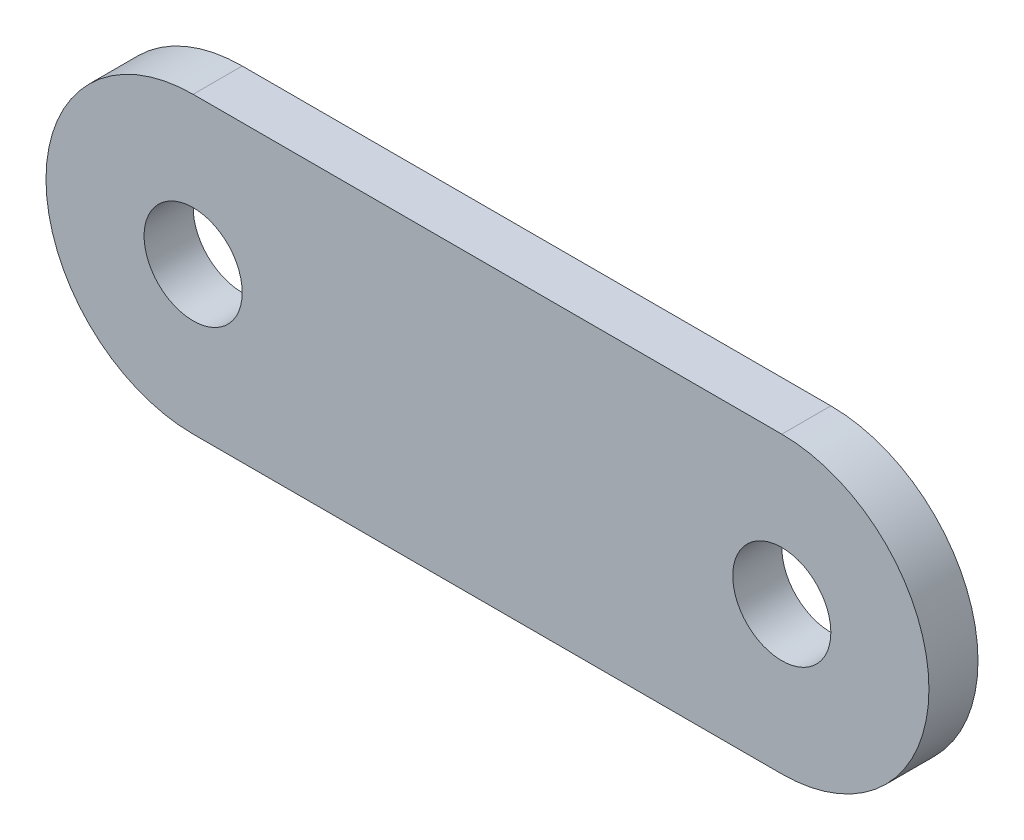
ISO-10303-21;
HEADER;
FILE_DESCRIPTION(('STEP AP214'),'2;1');
FILE_NAME('part.step','',(''),(''),'','','');
FILE_SCHEMA(('AUTOMOTIVE_DESIGN { 1 0 10303 214 1 1 1 1 }'));
ENDSEC;
DATA;
#1=APPLICATION_CONTEXT('core data for automotive mechanical design processes');
#2=APPLICATION_PROTOCOL_DEFINITION('international standard','automotive_design',2000,#1);
#3=PRODUCT_CONTEXT('',#1,'mechanical');
#4=PRODUCT('Part','Part','',(#3));
#5=PRODUCT_RELATED_PRODUCT_CATEGORY('part','',(#4));
#6=PRODUCT_DEFINITION_FORMATION('','',#4);
#7=PRODUCT_DEFINITION_CONTEXT('part definition',#1,'design');
#8=PRODUCT_DEFINITION('design','',#6,#7);
#9=PRODUCT_DEFINITION_SHAPE('','',#8);
#10=(LENGTH_UNIT() NAMED_UNIT(*) SI_UNIT(.MILLI.,.METRE.));
#11=(NAMED_UNIT(*) PLANE_ANGLE_UNIT() SI_UNIT($,.RADIAN.));
#12=(NAMED_UNIT(*) SI_UNIT($,.STERADIAN.) SOLID_ANGLE_UNIT());
#13=UNCERTAINTY_MEASURE_WITH_UNIT(LENGTH_MEASURE(1.E-05),#10,'distance_accuracy_value','');
#14=(GEOMETRIC_REPRESENTATION_CONTEXT(3) GLOBAL_UNCERTAINTY_ASSIGNED_CONTEXT((#13)) GLOBAL_UNIT_ASSIGNED_CONTEXT((#10,
#11,#12)) REPRESENTATION_CONTEXT('',''));
#15=CARTESIAN_POINT('',(0.,0.,0.));
#16=DIRECTION('',(0.,0.,1.));
#17=DIRECTION('',(1.,0.,0.));
#18=AXIS2_PLACEMENT_3D('',#15,#16,#17);
#19=CARTESIAN_POINT('',(-6.,0.,1.));
#20=DIRECTION('',(0.,0.,1.));
#21=DIRECTION('',(1.,0.,0.));
#22=AXIS2_PLACEMENT_3D('',#19,#20,#21);
#23=PLANE('',#22);
#24=CARTESIAN_POINT('',(6.,0.,1.));
#25=DIRECTION('',(0.,0.,1.));
#26=DIRECTION('',(1.,0.,0.));
#27=AXIS2_PLACEMENT_3D('',#24,#25,#26);
#28=CIRCLE('',#27,1.);
#29=CARTESIAN_POINT('',(7.,0.,1.));
#30=VERTEX_POINT('',#29);
#31=EDGE_CURVE('E100',#30,#30,#28,.T.);
#32=ORIENTED_EDGE('',*,*,#31,.F.);
#33=EDGE_LOOP('',(#32));
#34=FACE_BOUND('',#33,.T.);
#35=CARTESIAN_POINT('',(-6.,0.,1.));
#36=DIRECTION('',(0.,0.,1.));
#37=DIRECTION('',(1.,0.,0.));
#38=AXIS2_PLACEMENT_3D('',#35,#36,#37);
#39=CIRCLE('',#38,3.);
#40=CARTESIAN_POINT('',(-6.,3.,1.));
#41=VERTEX_POINT('',#40);
#42=CARTESIAN_POINT('',(-6.,-3.,1.));
#43=VERTEX_POINT('',#42);
#44=EDGE_CURVE('E85',#41,#43,#39,.T.);
#45=ORIENTED_EDGE('',*,*,#44,.T.);
#46=DIRECTION('',(1.,0.,0.));
#47=VECTOR('',#46,1.);
#48=CARTESIAN_POINT('',(-6.,-3.,1.));
#49=LINE('',#48,#47);
#50=CARTESIAN_POINT('',(6.,-3.,1.));
#51=VERTEX_POINT('',#50);
#52=EDGE_CURVE('E80',#43,#51,#49,.T.);
#53=ORIENTED_EDGE('',*,*,#52,.T.);
#54=CARTESIAN_POINT('',(6.,0.,1.));
#55=DIRECTION('',(0.,0.,1.));
#56=DIRECTION('',(1.,0.,0.));
#57=AXIS2_PLACEMENT_3D('',#54,#55,#56);
#58=CIRCLE('',#57,3.);
#59=CARTESIAN_POINT('',(6.,3.,1.));
#60=VERTEX_POINT('',#59);
#61=EDGE_CURVE('E83',#51,#60,#58,.T.);
#62=ORIENTED_EDGE('',*,*,#61,.T.);
#63=DIRECTION('',(-1.,0.,0.));
#64=VECTOR('',#63,1.);
#65=CARTESIAN_POINT('',(-6.,3.,1.));
#66=LINE('',#65,#64);
#67=EDGE_CURVE('E50',#60,#41,#66,.T.);
#68=ORIENTED_EDGE('',*,*,#67,.T.);
#69=EDGE_LOOP('',(#45,#53,#62,#68));
#70=FACE_BOUND('',#69,.T.);
#71=CARTESIAN_POINT('',(-6.,0.,1.));
#72=DIRECTION('',(0.,0.,1.));
#73=DIRECTION('',(1.,0.,0.));
#74=AXIS2_PLACEMENT_3D('',#71,#72,#73);
#75=CIRCLE('',#74,1.);
#76=CARTESIAN_POINT('',(-5.,0.,1.));
#77=VERTEX_POINT('',#76);
#78=EDGE_CURVE('E115',#77,#77,#75,.T.);
#79=ORIENTED_EDGE('',*,*,#78,.F.);
#80=EDGE_LOOP('',(#79));
#81=FACE_BOUND('',#80,.T.);
#82=ADVANCED_FACE('F33',(#34,#70,#81),#23,.T.);
#83=CARTESIAN_POINT('',(-6.,0.,0.));
#84=DIRECTION('',(0.,0.,1.));
#85=DIRECTION('',(1.,0.,0.));
#86=AXIS2_PLACEMENT_3D('',#83,#84,#85);
#87=PLANE('',#86);
#88=CARTESIAN_POINT('',(-6.,0.,0.));
#89=DIRECTION('',(0.,0.,1.));
#90=DIRECTION('',(1.,0.,0.));
#91=AXIS2_PLACEMENT_3D('',#88,#89,#90);
#92=CIRCLE('',#91,3.);
#93=CARTESIAN_POINT('',(-6.,3.,0.));
#94=VERTEX_POINT('',#93);
#95=CARTESIAN_POINT('',(-6.,-3.,0.));
#96=VERTEX_POINT('',#95);
#97=EDGE_CURVE('E97',#94,#96,#92,.T.);
#98=ORIENTED_EDGE('',*,*,#97,.F.);
#99=DIRECTION('',(-1.,0.,0.));
#100=VECTOR('',#99,1.);
#101=CARTESIAN_POINT('',(-6.,3.,0.));
#102=LINE('',#101,#100);
#103=CARTESIAN_POINT('',(6.,3.,0.));
#104=VERTEX_POINT('',#103);
#105=EDGE_CURVE('E73',#104,#94,#102,.T.);
#106=ORIENTED_EDGE('',*,*,#105,.F.);
#107=CARTESIAN_POINT('',(6.,0.,0.));
#108=DIRECTION('',(0.,0.,1.));
#109=DIRECTION('',(1.,0.,0.));
#110=AXIS2_PLACEMENT_3D('',#107,#108,#109);
#111=CIRCLE('',#110,3.);
#112=CARTESIAN_POINT('',(6.,-3.,0.));
#113=VERTEX_POINT('',#112);
#114=EDGE_CURVE('E67',#113,#104,#111,.T.);
#115=ORIENTED_EDGE('',*,*,#114,.F.);
#116=DIRECTION('',(1.,0.,0.));
#117=VECTOR('',#116,1.);
#118=CARTESIAN_POINT('',(-6.,-3.,0.));
#119=LINE('',#118,#117);
#120=EDGE_CURVE('E89',#96,#113,#119,.T.);
#121=ORIENTED_EDGE('',*,*,#120,.F.);
#122=EDGE_LOOP('',(#98,#106,#115,#121));
#123=FACE_BOUND('',#122,.T.);
#124=CARTESIAN_POINT('',(6.,0.,0.));
#125=DIRECTION('',(0.,0.,1.));
#126=DIRECTION('',(1.,0.,0.));
#127=AXIS2_PLACEMENT_3D('',#124,#125,#126);
#128=CIRCLE('',#127,1.);
#129=CARTESIAN_POINT('',(7.,0.,0.));
#130=VERTEX_POINT('',#129);
#131=EDGE_CURVE('E112',#130,#130,#128,.T.);
#132=ORIENTED_EDGE('',*,*,#131,.T.);
#133=EDGE_LOOP('',(#132));
#134=FACE_BOUND('',#133,.T.);
#135=CARTESIAN_POINT('',(-6.,0.,0.));
#136=DIRECTION('',(0.,0.,1.));
#137=DIRECTION('',(1.,0.,0.));
#138=AXIS2_PLACEMENT_3D('',#135,#136,#137);
#139=CIRCLE('',#138,1.);
#140=CARTESIAN_POINT('',(-5.,0.,0.));
#141=VERTEX_POINT('',#140);
#142=EDGE_CURVE('E118',#141,#141,#139,.T.);
#143=ORIENTED_EDGE('',*,*,#142,.T.);
#144=EDGE_LOOP('',(#143));
#145=FACE_BOUND('',#144,.T.);
#146=ADVANCED_FACE('F108',(#123,#134,#145),#87,.F.);
#147=CARTESIAN_POINT('',(-6.,0.,1.));
#148=DIRECTION('',(0.,0.,-1.));
#149=DIRECTION('',(-1.,0.,0.));
#150=AXIS2_PLACEMENT_3D('',#147,#148,#149);
#151=CYLINDRICAL_SURFACE('',#150,3.);
#152=ORIENTED_EDGE('',*,*,#97,.T.);
#153=DIRECTION('',(0.,0.,-1.));
#154=VECTOR('',#153,1.);
#155=CARTESIAN_POINT('',(-6.,-3.,1.));
#156=LINE('',#155,#154);
#157=EDGE_CURVE('E11',#43,#96,#156,.T.);
#158=ORIENTED_EDGE('',*,*,#157,.F.);
#159=ORIENTED_EDGE('',*,*,#44,.F.);
#160=DIRECTION('',(0.,0.,-1.));
#161=VECTOR('',#160,1.);
#162=CARTESIAN_POINT('',(-6.,3.,1.));
#163=LINE('',#162,#161);
#164=EDGE_CURVE('E93',#41,#94,#163,.T.);
#165=ORIENTED_EDGE('',*,*,#164,.T.);
#166=EDGE_LOOP('',(#152,#158,#159,#165));
#167=FACE_BOUND('',#166,.T.);
#168=ADVANCED_FACE('F35',(#167),#151,.T.);
#169=CARTESIAN_POINT('',(-6.,-3.,1.));
#170=DIRECTION('',(0.,1.,0.));
#171=DIRECTION('',(-1.,0.,0.));
#172=AXIS2_PLACEMENT_3D('',#169,#170,#171);
#173=PLANE('',#172);
#174=ORIENTED_EDGE('',*,*,#120,.T.);
#175=DIRECTION('',(0.,0.,-1.));
#176=VECTOR('',#175,1.);
#177=CARTESIAN_POINT('',(6.,-3.,1.));
#178=LINE('',#177,#176);
#179=EDGE_CURVE('E42',#51,#113,#178,.T.);
#180=ORIENTED_EDGE('',*,*,#179,.F.);
#181=ORIENTED_EDGE('',*,*,#52,.F.);
#182=ORIENTED_EDGE('',*,*,#157,.T.);
#183=EDGE_LOOP('',(#174,#180,#181,#182));
#184=FACE_BOUND('',#183,.T.);
#185=ADVANCED_FACE('F88',(#184),#173,.F.);
#186=CARTESIAN_POINT('',(6.,0.,1.));
#187=DIRECTION('',(0.,0.,-1.));
#188=DIRECTION('',(-1.,0.,0.));
#189=AXIS2_PLACEMENT_3D('',#186,#187,#188);
#190=CYLINDRICAL_SURFACE('',#189,3.);
#191=ORIENTED_EDGE('',*,*,#114,.T.);
#192=DIRECTION('',(0.,0.,-1.));
#193=VECTOR('',#192,1.);
#194=CARTESIAN_POINT('',(6.,3.,1.));
#195=LINE('',#194,#193);
#196=EDGE_CURVE('E90',#60,#104,#195,.T.);
#197=ORIENTED_EDGE('',*,*,#196,.F.);
#198=ORIENTED_EDGE('',*,*,#61,.F.);
#199=ORIENTED_EDGE('',*,*,#179,.T.);
#200=EDGE_LOOP('',(#191,#197,#198,#199));
#201=FACE_BOUND('',#200,.T.);
#202=ADVANCED_FACE('F91',(#201),#190,.T.);
#203=CARTESIAN_POINT('',(-6.,3.,1.));
#204=DIRECTION('',(0.,-1.,0.));
#205=DIRECTION('',(1.,0.,0.));
#206=AXIS2_PLACEMENT_3D('',#203,#204,#205);
#207=PLANE('',#206);
#208=ORIENTED_EDGE('',*,*,#105,.T.);
#209=ORIENTED_EDGE('',*,*,#164,.F.);
#210=ORIENTED_EDGE('',*,*,#67,.F.);
#211=ORIENTED_EDGE('',*,*,#196,.T.);
#212=EDGE_LOOP('',(#208,#209,#210,#211));
#213=FACE_BOUND('',#212,.T.);
#214=ADVANCED_FACE('F105',(#213),#207,.F.);
#215=CARTESIAN_POINT('',(6.,0.,1.));
#216=DIRECTION('',(0.,0.,-1.));
#217=DIRECTION('',(-1.,0.,0.));
#218=AXIS2_PLACEMENT_3D('',#215,#216,#217);
#219=CYLINDRICAL_SURFACE('',#218,1.);
#220=ORIENTED_EDGE('',*,*,#31,.T.);
#221=EDGE_LOOP('',(#220));
#222=FACE_BOUND('',#221,.T.);
#223=ORIENTED_EDGE('',*,*,#131,.F.);
#224=EDGE_LOOP('',(#223));
#225=FACE_BOUND('',#224,.T.);
#226=ADVANCED_FACE('F135',(#222,#225),#219,.F.);
#227=CARTESIAN_POINT('',(-6.,0.,1.));
#228=DIRECTION('',(0.,0.,-1.));
#229=DIRECTION('',(-1.,0.,0.));
#230=AXIS2_PLACEMENT_3D('',#227,#228,#229);
#231=CYLINDRICAL_SURFACE('',#230,1.);
#232=ORIENTED_EDGE('',*,*,#78,.T.);
#233=EDGE_LOOP('',(#232));
#234=FACE_BOUND('',#233,.T.);
#235=ORIENTED_EDGE('',*,*,#142,.F.);
#236=EDGE_LOOP('',(#235));
#237=FACE_BOUND('',#236,.T.);
#238=ADVANCED_FACE('F124',(#234,#237),#231,.F.);
#239=CLOSED_SHELL('',(#82,#146,#168,#185,#202,#214,#226,#238));
#240=MANIFOLD_SOLID_BREP('B2',#239);
#241=ADVANCED_BREP_SHAPE_REPRESENTATION('',(#18,#240),#14);
#242=SHAPE_DEFINITION_REPRESENTATION(#9,#241);
ENDSEC;
END-ISO-10303-21;
